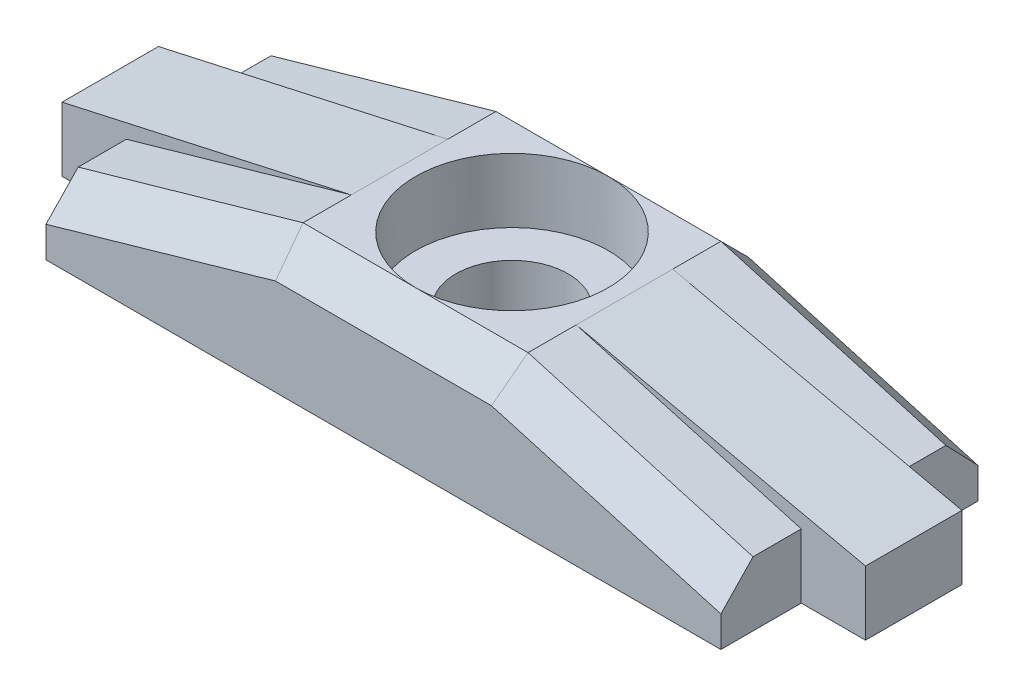
ISO-10303-21;
HEADER;
FILE_DESCRIPTION(('STEP AP214'),'2;1');
FILE_NAME('part.step','',(''),(''),'','','');
FILE_SCHEMA(('AUTOMOTIVE_DESIGN { 1 0 10303 214 1 1 1 1 }'));
ENDSEC;
DATA;
#1=APPLICATION_CONTEXT('core data for automotive mechanical design processes');
#2=APPLICATION_PROTOCOL_DEFINITION('international standard','automotive_design',2000,#1);
#3=PRODUCT_CONTEXT('',#1,'mechanical');
#4=PRODUCT('Part','Part','',(#3));
#5=PRODUCT_RELATED_PRODUCT_CATEGORY('part','',(#4));
#6=PRODUCT_DEFINITION_FORMATION('','',#4);
#7=PRODUCT_DEFINITION_CONTEXT('part definition',#1,'design');
#8=PRODUCT_DEFINITION('design','',#6,#7);
#9=PRODUCT_DEFINITION_SHAPE('','',#8);
#10=(LENGTH_UNIT() NAMED_UNIT(*) SI_UNIT(.MILLI.,.METRE.));
#11=(NAMED_UNIT(*) PLANE_ANGLE_UNIT() SI_UNIT($,.RADIAN.));
#12=(NAMED_UNIT(*) SI_UNIT($,.STERADIAN.) SOLID_ANGLE_UNIT());
#13=UNCERTAINTY_MEASURE_WITH_UNIT(LENGTH_MEASURE(1.E-05),#10,'distance_accuracy_value','');
#14=(GEOMETRIC_REPRESENTATION_CONTEXT(3) GLOBAL_UNCERTAINTY_ASSIGNED_CONTEXT((#13)) GLOBAL_UNIT_ASSIGNED_CONTEXT((#10,
#11,#12)) REPRESENTATION_CONTEXT('',''));
#15=CARTESIAN_POINT('',(0.,0.,0.));
#16=DIRECTION('',(0.,0.,1.));
#17=DIRECTION('',(1.,0.,0.));
#18=AXIS2_PLACEMENT_3D('',#15,#16,#17);
#19=CARTESIAN_POINT('',(-3.5,4.,26.5798724079689));
#20=DIRECTION('',(0.,-1.,0.));
#21=DIRECTION('',(0.,0.,-1.));
#22=AXIS2_PLACEMENT_3D('',#19,#20,#21);
#23=PLANE('',#22);
#24=DIRECTION('',(0.,0.,1.));
#25=VECTOR('',#24,1.);
#26=CARTESIAN_POINT('',(-3.5,4.,-25.095023109729));
#27=LINE('',#26,#25);
#28=CARTESIAN_POINT('',(-3.5,4.,1.5));
#29=VERTEX_POINT('',#28);
#30=CARTESIAN_POINT('',(-3.5,4.,3.));
#31=VERTEX_POINT('',#30);
#32=EDGE_CURVE('E408',#29,#31,#27,.T.);
#33=ORIENTED_EDGE('',*,*,#32,.T.);
#34=DIRECTION('',(1.,0.,0.));
#35=VECTOR('',#34,1.);
#36=CARTESIAN_POINT('',(-3.5,4.,3.));
#37=LINE('',#36,#35);
#38=CARTESIAN_POINT('',(0.,4.,3.));
#39=VERTEX_POINT('',#38);
#40=EDGE_CURVE('E318',#31,#39,#37,.T.);
#41=ORIENTED_EDGE('',*,*,#40,.T.);
#42=CARTESIAN_POINT('',(0.,4.,0.));
#43=DIRECTION('',(0.,1.,0.));
#44=DIRECTION('',(0.,0.,1.));
#45=AXIS2_PLACEMENT_3D('',#42,#43,#44);
#46=CIRCLE('',#45,3.);
#47=CARTESIAN_POINT('',(0.,4.,-3.));
#48=VERTEX_POINT('',#47);
#49=EDGE_CURVE('E339',#48,#39,#46,.T.);
#50=ORIENTED_EDGE('',*,*,#49,.F.);
#51=DIRECTION('',(-1.,0.,0.));
#52=VECTOR('',#51,1.);
#53=CARTESIAN_POINT('',(-3.5,4.,-3.));
#54=LINE('',#53,#52);
#55=CARTESIAN_POINT('',(-3.5,4.,-3.));
#56=VERTEX_POINT('',#55);
#57=EDGE_CURVE('E313',#48,#56,#54,.T.);
#58=ORIENTED_EDGE('',*,*,#57,.T.);
#59=CARTESIAN_POINT('',(-3.5,4.,-1.5));
#60=VERTEX_POINT('',#59);
#61=EDGE_CURVE('E193',#56,#60,#27,.T.);
#62=ORIENTED_EDGE('',*,*,#61,.T.);
#63=DIRECTION('',(0.,0.,-1.));
#64=VECTOR('',#63,1.);
#65=CARTESIAN_POINT('',(-3.5,4.,26.5798724079689));
#66=LINE('',#65,#64);
#67=EDGE_CURVE('E221',#29,#60,#66,.T.);
#68=ORIENTED_EDGE('',*,*,#67,.F.);
#69=EDGE_LOOP('',(#33,#41,#50,#58,#62,#68));
#70=FACE_BOUND('',#69,.T.);
#71=ADVANCED_FACE('F35',(#70),#23,.F.);
#72=CARTESIAN_POINT('',(0.,0.,0.));
#73=DIRECTION('',(0.,1.,0.));
#74=DIRECTION('',(0.,0.,1.));
#75=AXIS2_PLACEMENT_3D('',#72,#73,#74);
#76=CYLINDRICAL_SURFACE('',#75,1.75);
#77=CARTESIAN_POINT('',(0.,0.,0.));
#78=DIRECTION('',(0.,1.,0.));
#79=DIRECTION('',(0.,0.,1.));
#80=AXIS2_PLACEMENT_3D('',#77,#78,#79);
#81=CIRCLE('',#80,1.75);
#82=CARTESIAN_POINT('',(0.,0.,1.75));
#83=VERTEX_POINT('',#82);
#84=EDGE_CURVE('E206',#83,#83,#81,.T.);
#85=ORIENTED_EDGE('',*,*,#84,.F.);
#86=EDGE_LOOP('',(#85));
#87=FACE_BOUND('',#86,.T.);
#88=CARTESIAN_POINT('',(0.,2.,0.));
#89=DIRECTION('',(0.,1.,0.));
#90=DIRECTION('',(0.,0.,1.));
#91=AXIS2_PLACEMENT_3D('',#88,#89,#90);
#92=CIRCLE('',#91,1.75);
#93=CARTESIAN_POINT('',(0.,2.,1.75));
#94=VERTEX_POINT('',#93);
#95=EDGE_CURVE('E299',#94,#94,#92,.F.);
#96=ORIENTED_EDGE('',*,*,#95,.F.);
#97=EDGE_LOOP('',(#96));
#98=FACE_BOUND('',#97,.T.);
#99=ADVANCED_FACE('F437',(#87,#98),#76,.F.);
#100=CARTESIAN_POINT('',(0.,2.,-1.5));
#101=DIRECTION('',(0.,0.,-1.));
#102=DIRECTION('',(-1.,0.,0.));
#103=AXIS2_PLACEMENT_3D('',#100,#101,#102);
#104=PLANE('',#103);
#105=DIRECTION('',(0.961523947640823,-0.274721127897378,0.));
#106=VECTOR('',#105,1.);
#107=CARTESIAN_POINT('',(0.792452830188681,4.77358490566038,-1.5));
#108=LINE('',#107,#106);
#109=CARTESIAN_POINT('',(3.5,4.,-1.5));
#110=VERTEX_POINT('',#109);
#111=CARTESIAN_POINT('',(10.5,2.,-1.5));
#112=VERTEX_POINT('',#111);
#113=EDGE_CURVE('E192',#110,#112,#108,.T.);
#114=ORIENTED_EDGE('',*,*,#113,.F.);
#115=DIRECTION('',(-0.976187060183953,0.216930457818656,0.));
#116=VECTOR('',#115,1.);
#117=CARTESIAN_POINT('',(3.5,4.,-1.5));
#118=LINE('',#117,#116);
#119=CARTESIAN_POINT('',(12.5,2.,-1.5));
#120=VERTEX_POINT('',#119);
#121=EDGE_CURVE('E220',#120,#110,#118,.T.);
#122=ORIENTED_EDGE('',*,*,#121,.F.);
#123=DIRECTION('',(0.,-1.,0.));
#124=VECTOR('',#123,1.);
#125=CARTESIAN_POINT('',(12.5,2.,-1.5));
#126=LINE('',#125,#124);
#127=CARTESIAN_POINT('',(12.5,0.,-1.5));
#128=VERTEX_POINT('',#127);
#129=EDGE_CURVE('E291',#120,#128,#126,.T.);
#130=ORIENTED_EDGE('',*,*,#129,.T.);
#131=DIRECTION('',(1.,0.,0.));
#132=VECTOR('',#131,1.);
#133=CARTESIAN_POINT('',(0.,0.,-1.5));
#134=LINE('',#133,#132);
#135=CARTESIAN_POINT('',(10.5,0.,-1.5));
#136=VERTEX_POINT('',#135);
#137=EDGE_CURVE('E253',#136,#128,#134,.T.);
#138=ORIENTED_EDGE('',*,*,#137,.F.);
#139=DIRECTION('',(0.,-1.,0.));
#140=VECTOR('',#139,1.);
#141=CARTESIAN_POINT('',(10.5,2.,-1.5));
#142=LINE('',#141,#140);
#143=EDGE_CURVE('E289',#112,#136,#142,.T.);
#144=ORIENTED_EDGE('',*,*,#143,.F.);
#145=EDGE_LOOP('',(#114,#122,#130,#138,#144));
#146=FACE_BOUND('',#145,.T.);
#147=ADVANCED_FACE('F419',(#146),#104,.T.);
#148=CARTESIAN_POINT('',(0.,2.,1.5));
#149=DIRECTION('',(0.,0.,-1.));
#150=DIRECTION('',(-1.,0.,0.));
#151=AXIS2_PLACEMENT_3D('',#148,#149,#150);
#152=PLANE('',#151);
#153=DIRECTION('',(0.976187060183953,-0.216930457818656,0.));
#154=VECTOR('',#153,1.);
#155=CARTESIAN_POINT('',(3.5,4.,1.5));
#156=LINE('',#155,#154);
#157=CARTESIAN_POINT('',(3.5,4.,1.5));
#158=VERTEX_POINT('',#157);
#159=CARTESIAN_POINT('',(12.5,2.,1.5));
#160=VERTEX_POINT('',#159);
#161=EDGE_CURVE('E209',#158,#160,#156,.T.);
#162=ORIENTED_EDGE('',*,*,#161,.F.);
#163=DIRECTION('',(0.961523947640823,-0.274721127897378,0.));
#164=VECTOR('',#163,1.);
#165=CARTESIAN_POINT('',(0.792452830188681,4.77358490566038,1.5));
#166=LINE('',#165,#164);
#167=CARTESIAN_POINT('',(10.5,2.,1.5));
#168=VERTEX_POINT('',#167);
#169=EDGE_CURVE('E181',#158,#168,#166,.T.);
#170=ORIENTED_EDGE('',*,*,#169,.T.);
#171=DIRECTION('',(0.,-1.,0.));
#172=VECTOR('',#171,1.);
#173=CARTESIAN_POINT('',(10.5,2.,1.5));
#174=LINE('',#173,#172);
#175=CARTESIAN_POINT('',(10.5,0.,1.5));
#176=VERTEX_POINT('',#175);
#177=EDGE_CURVE('E294',#168,#176,#174,.T.);
#178=ORIENTED_EDGE('',*,*,#177,.T.);
#179=DIRECTION('',(1.,0.,0.));
#180=VECTOR('',#179,1.);
#181=CARTESIAN_POINT('',(0.,0.,1.5));
#182=LINE('',#181,#180);
#183=CARTESIAN_POINT('',(12.5,0.,1.5));
#184=VERTEX_POINT('',#183);
#185=EDGE_CURVE('E248',#176,#184,#182,.T.);
#186=ORIENTED_EDGE('',*,*,#185,.T.);
#187=DIRECTION('',(0.,-1.,0.));
#188=VECTOR('',#187,1.);
#189=CARTESIAN_POINT('',(12.5,2.,1.5));
#190=LINE('',#189,#188);
#191=EDGE_CURVE('E212',#160,#184,#190,.T.);
#192=ORIENTED_EDGE('',*,*,#191,.F.);
#193=EDGE_LOOP('',(#162,#170,#178,#186,#192));
#194=FACE_BOUND('',#193,.T.);
#195=ADVANCED_FACE('F210',(#194),#152,.F.);
#196=CARTESIAN_POINT('',(0.,2.,4.));
#197=DIRECTION('',(0.,0.,-1.));
#198=DIRECTION('',(-1.,0.,0.));
#199=AXIS2_PLACEMENT_3D('',#196,#197,#198);
#200=PLANE('',#199);
#201=DIRECTION('',(0.,-1.,0.));
#202=VECTOR('',#201,1.);
#203=CARTESIAN_POINT('',(10.5,2.,4.));
#204=LINE('',#203,#202);
#205=CARTESIAN_POINT('',(10.5,0.959984301531355,4.));
#206=VERTEX_POINT('',#205);
#207=CARTESIAN_POINT('',(10.5,0.,4.));
#208=VERTEX_POINT('',#207);
#209=EDGE_CURVE('E296',#206,#208,#204,.T.);
#210=ORIENTED_EDGE('',*,*,#209,.F.);
#211=DIRECTION('',(-0.961523947640823,0.274721127897378,0.));
#212=VECTOR('',#211,1.);
#213=CARTESIAN_POINT('',(3.22527887210262,3.03847605235918,4.));
#214=LINE('',#213,#212);
#215=CARTESIAN_POINT('',(3.35994505535974,3.,4.));
#216=VERTEX_POINT('',#215);
#217=EDGE_CURVE('E306',#206,#216,#214,.T.);
#218=ORIENTED_EDGE('',*,*,#217,.T.);
#219=DIRECTION('',(-1.,0.,0.));
#220=VECTOR('',#219,1.);
#221=CARTESIAN_POINT('',(0.,3.,4.));
#222=LINE('',#221,#220);
#223=CARTESIAN_POINT('',(-3.35994505535974,3.,4.));
#224=VERTEX_POINT('',#223);
#225=EDGE_CURVE('E304',#216,#224,#222,.T.);
#226=ORIENTED_EDGE('',*,*,#225,.T.);
#227=DIRECTION('',(-0.961523947640823,-0.274721127897378,0.));
#228=VECTOR('',#227,1.);
#229=CARTESIAN_POINT('',(-10.2252788721026,1.03847605235918,4.));
#230=LINE('',#229,#228);
#231=CARTESIAN_POINT('',(-10.5,0.959984301531356,4.));
#232=VERTEX_POINT('',#231);
#233=EDGE_CURVE('E298',#224,#232,#230,.T.);
#234=ORIENTED_EDGE('',*,*,#233,.T.);
#235=DIRECTION('',(0.,-1.,0.));
#236=VECTOR('',#235,1.);
#237=CARTESIAN_POINT('',(-10.5,2.,4.));
#238=LINE('',#237,#236);
#239=CARTESIAN_POINT('',(-10.5,0.,4.));
#240=VERTEX_POINT('',#239);
#241=EDGE_CURVE('E243',#232,#240,#238,.T.);
#242=ORIENTED_EDGE('',*,*,#241,.T.);
#243=DIRECTION('',(1.,0.,0.));
#244=VECTOR('',#243,1.);
#245=CARTESIAN_POINT('',(0.,0.,4.));
#246=LINE('',#245,#244);
#247=EDGE_CURVE('E216',#240,#208,#246,.T.);
#248=ORIENTED_EDGE('',*,*,#247,.T.);
#249=EDGE_LOOP('',(#210,#218,#226,#234,#242,#248));
#250=FACE_BOUND('',#249,.T.);
#251=ADVANCED_FACE('F433',(#250),#200,.F.);
#252=CARTESIAN_POINT('',(10.5,2.,0.));
#253=DIRECTION('',(-1.,0.,0.));
#254=DIRECTION('',(0.,0.,1.));
#255=AXIS2_PLACEMENT_3D('',#252,#253,#254);
#256=PLANE('',#255);
#257=DIRECTION('',(0.,0.,-1.));
#258=VECTOR('',#257,1.);
#259=CARTESIAN_POINT('',(10.5,2.,0.));
#260=LINE('',#259,#258);
#261=CARTESIAN_POINT('',(10.5,2.,2.99999999999999));
#262=VERTEX_POINT('',#261);
#263=EDGE_CURVE('E187',#262,#168,#260,.T.);
#264=ORIENTED_EDGE('',*,*,#263,.F.);
#265=DIRECTION('',(0.,-0.720838291947128,0.693103280083674));
#266=VECTOR('',#265,1.);
#267=CARTESIAN_POINT('',(10.5,2.4419457014713,2.57505862447842));
#268=LINE('',#267,#266);
#269=EDGE_CURVE('E311',#262,#206,#268,.T.);
#270=ORIENTED_EDGE('',*,*,#269,.T.);
#271=ORIENTED_EDGE('',*,*,#209,.T.);
#272=DIRECTION('',(0.,0.,-1.));
#273=VECTOR('',#272,1.);
#274=CARTESIAN_POINT('',(10.5,0.,0.));
#275=LINE('',#274,#273);
#276=EDGE_CURVE('E246',#208,#176,#275,.T.);
#277=ORIENTED_EDGE('',*,*,#276,.T.);
#278=ORIENTED_EDGE('',*,*,#177,.F.);
#279=EDGE_LOOP('',(#264,#270,#271,#277,#278));
#280=FACE_BOUND('',#279,.T.);
#281=ADVANCED_FACE('F426',(#280),#256,.F.);
#282=CARTESIAN_POINT('',(12.5,2.,0.));
#283=DIRECTION('',(-1.,0.,0.));
#284=DIRECTION('',(0.,0.,1.));
#285=AXIS2_PLACEMENT_3D('',#282,#283,#284);
#286=PLANE('',#285);
#287=DIRECTION('',(0.,0.,-1.));
#288=VECTOR('',#287,1.);
#289=CARTESIAN_POINT('',(12.5,0.,0.));
#290=LINE('',#289,#288);
#291=EDGE_CURVE('E250',#184,#128,#290,.T.);
#292=ORIENTED_EDGE('',*,*,#291,.T.);
#293=ORIENTED_EDGE('',*,*,#129,.F.);
#294=DIRECTION('',(0.,0.,-1.));
#295=VECTOR('',#294,1.);
#296=CARTESIAN_POINT('',(12.5,2.,0.));
#297=LINE('',#296,#295);
#298=EDGE_CURVE('E230',#160,#120,#297,.T.);
#299=ORIENTED_EDGE('',*,*,#298,.F.);
#300=ORIENTED_EDGE('',*,*,#191,.T.);
#301=EDGE_LOOP('',(#292,#293,#299,#300));
#302=FACE_BOUND('',#301,.T.);
#303=ADVANCED_FACE('F424',(#302),#286,.F.);
#304=CARTESIAN_POINT('',(10.5,2.,0.));
#305=DIRECTION('',(-1.,0.,0.));
#306=DIRECTION('',(0.,0.,1.));
#307=AXIS2_PLACEMENT_3D('',#304,#305,#306);
#308=PLANE('',#307);
#309=DIRECTION('',(0.,-1.,0.));
#310=VECTOR('',#309,1.);
#311=CARTESIAN_POINT('',(10.5,2.,-4.));
#312=LINE('',#311,#310);
#313=CARTESIAN_POINT('',(10.5,0.959984301531352,-4.));
#314=VERTEX_POINT('',#313);
#315=CARTESIAN_POINT('',(10.5,0.,-4.));
#316=VERTEX_POINT('',#315);
#317=EDGE_CURVE('E287',#314,#316,#312,.T.);
#318=ORIENTED_EDGE('',*,*,#317,.F.);
#319=DIRECTION('',(0.,-0.72083829194713,-0.693103280083672));
#320=VECTOR('',#319,1.);
#321=CARTESIAN_POINT('',(10.5,2.,-3.));
#322=LINE('',#321,#320);
#323=CARTESIAN_POINT('',(10.5,2.,-3.));
#324=VERTEX_POINT('',#323);
#325=EDGE_CURVE('E12',#314,#324,#322,.F.);
#326=ORIENTED_EDGE('',*,*,#325,.T.);
#327=DIRECTION('',(0.,0.,-1.));
#328=VECTOR('',#327,1.);
#329=CARTESIAN_POINT('',(10.5,2.,0.));
#330=LINE('',#329,#328);
#331=EDGE_CURVE('E233',#112,#324,#330,.T.);
#332=ORIENTED_EDGE('',*,*,#331,.F.);
#333=ORIENTED_EDGE('',*,*,#143,.T.);
#334=DIRECTION('',(0.,0.,-1.));
#335=VECTOR('',#334,1.);
#336=CARTESIAN_POINT('',(10.5,0.,0.));
#337=LINE('',#336,#335);
#338=EDGE_CURVE('E256',#136,#316,#337,.T.);
#339=ORIENTED_EDGE('',*,*,#338,.T.);
#340=EDGE_LOOP('',(#318,#326,#332,#333,#339));
#341=FACE_BOUND('',#340,.T.);
#342=ADVANCED_FACE('F356',(#341),#308,.F.);
#343=CARTESIAN_POINT('',(0.,2.,-4.));
#344=DIRECTION('',(0.,0.,-1.));
#345=DIRECTION('',(-1.,0.,0.));
#346=AXIS2_PLACEMENT_3D('',#343,#344,#345);
#347=PLANE('',#346);
#348=DIRECTION('',(0.,-1.,0.));
#349=VECTOR('',#348,1.);
#350=CARTESIAN_POINT('',(-10.5,2.,-4.));
#351=LINE('',#350,#349);
#352=CARTESIAN_POINT('',(-10.5,0.959984301531351,-4.));
#353=VERTEX_POINT('',#352);
#354=CARTESIAN_POINT('',(-10.5,0.,-4.));
#355=VERTEX_POINT('',#354);
#356=EDGE_CURVE('E285',#353,#355,#351,.T.);
#357=ORIENTED_EDGE('',*,*,#356,.F.);
#358=DIRECTION('',(0.961523947640823,0.274721127897378,0.));
#359=VECTOR('',#358,1.);
#360=CARTESIAN_POINT('',(-0.517731702291301,3.81206095801955,-4.));
#361=LINE('',#360,#359);
#362=CARTESIAN_POINT('',(-3.35994505535974,3.,-4.));
#363=VERTEX_POINT('',#362);
#364=EDGE_CURVE('E58',#353,#363,#361,.T.);
#365=ORIENTED_EDGE('',*,*,#364,.T.);
#366=DIRECTION('',(1.,0.,0.));
#367=VECTOR('',#366,1.);
#368=CARTESIAN_POINT('',(3.5,3.,-4.));
#369=LINE('',#368,#367);
#370=CARTESIAN_POINT('',(3.35994505535974,3.,-4.));
#371=VERTEX_POINT('',#370);
#372=EDGE_CURVE('E331',#363,#371,#369,.T.);
#373=ORIENTED_EDGE('',*,*,#372,.T.);
#374=DIRECTION('',(0.961523947640823,-0.274721127897378,0.));
#375=VECTOR('',#374,1.);
#376=CARTESIAN_POINT('',(0.517731702291302,3.81206095801955,-4.));
#377=LINE('',#376,#375);
#378=EDGE_CURVE('E329',#371,#314,#377,.T.);
#379=ORIENTED_EDGE('',*,*,#378,.T.);
#380=ORIENTED_EDGE('',*,*,#317,.T.);
#381=DIRECTION('',(1.,0.,0.));
#382=VECTOR('',#381,1.);
#383=CARTESIAN_POINT('',(0.,0.,-4.));
#384=LINE('',#383,#382);
#385=EDGE_CURVE('E259',#355,#316,#384,.T.);
#386=ORIENTED_EDGE('',*,*,#385,.F.);
#387=EDGE_LOOP('',(#357,#365,#373,#379,#380,#386));
#388=FACE_BOUND('',#387,.T.);
#389=ADVANCED_FACE('F354',(#388),#347,.T.);
#390=CARTESIAN_POINT('',(-10.5,2.,0.));
#391=DIRECTION('',(-1.,0.,0.));
#392=DIRECTION('',(0.,0.,1.));
#393=AXIS2_PLACEMENT_3D('',#390,#391,#392);
#394=PLANE('',#393);
#395=DIRECTION('',(0.,0.,-1.));
#396=VECTOR('',#395,1.);
#397=CARTESIAN_POINT('',(-10.5,2.,0.));
#398=LINE('',#397,#396);
#399=CARTESIAN_POINT('',(-10.5,2.,-1.5));
#400=VERTEX_POINT('',#399);
#401=CARTESIAN_POINT('',(-10.5,2.,-3.));
#402=VERTEX_POINT('',#401);
#403=EDGE_CURVE('E235',#400,#402,#398,.T.);
#404=ORIENTED_EDGE('',*,*,#403,.T.);
#405=DIRECTION('',(0.,0.72083829194713,0.693103280083672));
#406=VECTOR('',#405,1.);
#407=CARTESIAN_POINT('',(-10.5,3.4988461536754,-1.55882352941177));
#408=LINE('',#407,#406);
#409=EDGE_CURVE('E327',#402,#353,#408,.F.);
#410=ORIENTED_EDGE('',*,*,#409,.T.);
#411=ORIENTED_EDGE('',*,*,#356,.T.);
#412=DIRECTION('',(0.,0.,-1.));
#413=VECTOR('',#412,1.);
#414=CARTESIAN_POINT('',(-10.5,0.,0.));
#415=LINE('',#414,#413);
#416=CARTESIAN_POINT('',(-10.5,0.,-1.5));
#417=VERTEX_POINT('',#416);
#418=EDGE_CURVE('E262',#417,#355,#415,.T.);
#419=ORIENTED_EDGE('',*,*,#418,.F.);
#420=DIRECTION('',(0.,-1.,0.));
#421=VECTOR('',#420,1.);
#422=CARTESIAN_POINT('',(-10.5,2.,-1.5));
#423=LINE('',#422,#421);
#424=EDGE_CURVE('E283',#400,#417,#423,.T.);
#425=ORIENTED_EDGE('',*,*,#424,.F.);
#426=EDGE_LOOP('',(#404,#410,#411,#419,#425));
#427=FACE_BOUND('',#426,.T.);
#428=ADVANCED_FACE('F371',(#427),#394,.T.);
#429=DIRECTION('',(0.961523947640823,0.274721127897378,0.));
#430=VECTOR('',#429,1.);
#431=CARTESIAN_POINT('',(-0.79245283018868,4.77358490566038,-1.5));
#432=LINE('',#431,#430);
#433=EDGE_CURVE('E377',#400,#60,#432,.T.);
#434=ORIENTED_EDGE('',*,*,#433,.F.);
#435=ORIENTED_EDGE('',*,*,#424,.T.);
#436=DIRECTION('',(1.,0.,0.));
#437=VECTOR('',#436,1.);
#438=CARTESIAN_POINT('',(0.,0.,-1.5));
#439=LINE('',#438,#437);
#440=CARTESIAN_POINT('',(-12.5,0.,-1.5));
#441=VERTEX_POINT('',#440);
#442=EDGE_CURVE('E265',#441,#417,#439,.T.);
#443=ORIENTED_EDGE('',*,*,#442,.F.);
#444=DIRECTION('',(0.,-1.,0.));
#445=VECTOR('',#444,1.);
#446=CARTESIAN_POINT('',(-12.5,2.,-1.5));
#447=LINE('',#446,#445);
#448=CARTESIAN_POINT('',(-12.5,2.,-1.5));
#449=VERTEX_POINT('',#448);
#450=EDGE_CURVE('E281',#449,#441,#447,.T.);
#451=ORIENTED_EDGE('',*,*,#450,.F.);
#452=DIRECTION('',(-0.976187060183953,-0.216930457818656,0.));
#453=VECTOR('',#452,1.);
#454=CARTESIAN_POINT('',(-12.5,2.,-1.5));
#455=LINE('',#454,#453);
#456=EDGE_CURVE('E226',#60,#449,#455,.T.);
#457=ORIENTED_EDGE('',*,*,#456,.F.);
#458=EDGE_LOOP('',(#434,#435,#443,#451,#457));
#459=FACE_BOUND('',#458,.T.);
#460=ADVANCED_FACE('F374',(#459),#104,.T.);
#461=CARTESIAN_POINT('',(-12.5,2.,0.));
#462=DIRECTION('',(-1.,0.,0.));
#463=DIRECTION('',(0.,0.,1.));
#464=AXIS2_PLACEMENT_3D('',#461,#462,#463);
#465=PLANE('',#464);
#466=DIRECTION('',(0.,0.,-1.));
#467=VECTOR('',#466,1.);
#468=CARTESIAN_POINT('',(-12.5,0.,0.));
#469=LINE('',#468,#467);
#470=CARTESIAN_POINT('',(-12.5,0.,1.5));
#471=VERTEX_POINT('',#470);
#472=EDGE_CURVE('E268',#471,#441,#469,.T.);
#473=ORIENTED_EDGE('',*,*,#472,.F.);
#474=DIRECTION('',(0.,-1.,0.));
#475=VECTOR('',#474,1.);
#476=CARTESIAN_POINT('',(-12.5,2.,1.5));
#477=LINE('',#476,#475);
#478=CARTESIAN_POINT('',(-12.5,2.,1.5));
#479=VERTEX_POINT('',#478);
#480=EDGE_CURVE('E279',#479,#471,#477,.T.);
#481=ORIENTED_EDGE('',*,*,#480,.F.);
#482=DIRECTION('',(0.,0.,-1.));
#483=VECTOR('',#482,1.);
#484=CARTESIAN_POINT('',(-12.5,2.,0.));
#485=LINE('',#484,#483);
#486=EDGE_CURVE('E238',#479,#449,#485,.T.);
#487=ORIENTED_EDGE('',*,*,#486,.T.);
#488=ORIENTED_EDGE('',*,*,#450,.T.);
#489=EDGE_LOOP('',(#473,#481,#487,#488));
#490=FACE_BOUND('',#489,.T.);
#491=ADVANCED_FACE('F392',(#490),#465,.T.);
#492=DIRECTION('',(0.,-1.,0.));
#493=VECTOR('',#492,1.);
#494=CARTESIAN_POINT('',(-10.5,2.,1.5));
#495=LINE('',#494,#493);
#496=CARTESIAN_POINT('',(-10.5,2.,1.5));
#497=VERTEX_POINT('',#496);
#498=CARTESIAN_POINT('',(-10.5,0.,1.5));
#499=VERTEX_POINT('',#498);
#500=EDGE_CURVE('E277',#497,#499,#495,.T.);
#501=ORIENTED_EDGE('',*,*,#500,.F.);
#502=DIRECTION('',(0.961523947640823,0.274721127897378,0.));
#503=VECTOR('',#502,1.);
#504=CARTESIAN_POINT('',(-0.79245283018868,4.77358490566038,1.5));
#505=LINE('',#504,#503);
#506=EDGE_CURVE('E378',#497,#29,#505,.T.);
#507=ORIENTED_EDGE('',*,*,#506,.T.);
#508=DIRECTION('',(0.976187060183953,0.216930457818656,0.));
#509=VECTOR('',#508,1.);
#510=CARTESIAN_POINT('',(-12.5,2.,1.5));
#511=LINE('',#510,#509);
#512=EDGE_CURVE('E217',#479,#29,#511,.T.);
#513=ORIENTED_EDGE('',*,*,#512,.F.);
#514=ORIENTED_EDGE('',*,*,#480,.T.);
#515=DIRECTION('',(1.,0.,0.));
#516=VECTOR('',#515,1.);
#517=CARTESIAN_POINT('',(0.,0.,1.5));
#518=LINE('',#517,#516);
#519=EDGE_CURVE('E271',#471,#499,#518,.T.);
#520=ORIENTED_EDGE('',*,*,#519,.T.);
#521=EDGE_LOOP('',(#501,#507,#513,#514,#520));
#522=FACE_BOUND('',#521,.T.);
#523=ADVANCED_FACE('F396',(#522),#152,.F.);
#524=CARTESIAN_POINT('',(-10.5,2.,0.));
#525=DIRECTION('',(-1.,0.,0.));
#526=DIRECTION('',(0.,0.,1.));
#527=AXIS2_PLACEMENT_3D('',#524,#525,#526);
#528=PLANE('',#527);
#529=ORIENTED_EDGE('',*,*,#241,.F.);
#530=DIRECTION('',(0.,0.720838291947128,-0.693103280083674));
#531=VECTOR('',#530,1.);
#532=CARTESIAN_POINT('',(-10.5,3.4988461536754,1.55882352941176));
#533=LINE('',#532,#531);
#534=CARTESIAN_POINT('',(-10.5,2.,3.));
#535=VERTEX_POINT('',#534);
#536=EDGE_CURVE('E320',#232,#535,#533,.T.);
#537=ORIENTED_EDGE('',*,*,#536,.T.);
#538=DIRECTION('',(0.,0.,-1.));
#539=VECTOR('',#538,1.);
#540=CARTESIAN_POINT('',(-10.5,2.,0.));
#541=LINE('',#540,#539);
#542=EDGE_CURVE('E241',#535,#497,#541,.T.);
#543=ORIENTED_EDGE('',*,*,#542,.T.);
#544=ORIENTED_EDGE('',*,*,#500,.T.);
#545=DIRECTION('',(0.,0.,-1.));
#546=VECTOR('',#545,1.);
#547=CARTESIAN_POINT('',(-10.5,0.,0.));
#548=LINE('',#547,#546);
#549=EDGE_CURVE('E231',#240,#499,#548,.T.);
#550=ORIENTED_EDGE('',*,*,#549,.F.);
#551=EDGE_LOOP('',(#529,#537,#543,#544,#550));
#552=FACE_BOUND('',#551,.T.);
#553=ADVANCED_FACE('F401',(#552),#528,.T.);
#554=CARTESIAN_POINT('',(0.,0.,0.));
#555=DIRECTION('',(0.,1.,0.));
#556=DIRECTION('',(0.,0.,1.));
#557=AXIS2_PLACEMENT_3D('',#554,#555,#556);
#558=PLANE('',#557);
#559=ORIENTED_EDGE('',*,*,#84,.T.);
#560=EDGE_LOOP('',(#559));
#561=FACE_BOUND('',#560,.T.);
#562=ORIENTED_EDGE('',*,*,#247,.F.);
#563=ORIENTED_EDGE('',*,*,#549,.T.);
#564=ORIENTED_EDGE('',*,*,#519,.F.);
#565=ORIENTED_EDGE('',*,*,#472,.T.);
#566=ORIENTED_EDGE('',*,*,#442,.T.);
#567=ORIENTED_EDGE('',*,*,#418,.T.);
#568=ORIENTED_EDGE('',*,*,#385,.T.);
#569=ORIENTED_EDGE('',*,*,#338,.F.);
#570=ORIENTED_EDGE('',*,*,#137,.T.);
#571=ORIENTED_EDGE('',*,*,#291,.F.);
#572=ORIENTED_EDGE('',*,*,#185,.F.);
#573=ORIENTED_EDGE('',*,*,#276,.F.);
#574=EDGE_LOOP('',(#562,#563,#564,#565,#566,#567,#568,#569,#570,#571,#572,#573));
#575=FACE_BOUND('',#574,.T.);
#576=ADVANCED_FACE('F361',(#561,#575),#558,.F.);
#577=CARTESIAN_POINT('',(-12.5,2.,26.5798724079689));
#578=DIRECTION('',(0.216930457818656,-0.976187060183953,0.));
#579=DIRECTION('',(0.976187060183953,0.216930457818656,0.));
#580=AXIS2_PLACEMENT_3D('',#577,#578,#579);
#581=PLANE('',#580);
#582=ORIENTED_EDGE('',*,*,#486,.F.);
#583=ORIENTED_EDGE('',*,*,#512,.T.);
#584=ORIENTED_EDGE('',*,*,#67,.T.);
#585=ORIENTED_EDGE('',*,*,#456,.T.);
#586=EDGE_LOOP('',(#582,#583,#584,#585));
#587=FACE_BOUND('',#586,.T.);
#588=ADVANCED_FACE('F387',(#587),#581,.F.);
#589=EDGE_CURVE('E477',#39,#48,#46,.T.);
#590=ORIENTED_EDGE('',*,*,#589,.F.);
#591=DIRECTION('',(1.,0.,0.));
#592=VECTOR('',#591,1.);
#593=CARTESIAN_POINT('',(-3.5,4.,3.));
#594=LINE('',#593,#592);
#595=CARTESIAN_POINT('',(3.5,4.,3.));
#596=VERTEX_POINT('',#595);
#597=EDGE_CURVE('E204',#39,#596,#594,.T.);
#598=ORIENTED_EDGE('',*,*,#597,.T.);
#599=DIRECTION('',(0.,0.,1.));
#600=VECTOR('',#599,1.);
#601=CARTESIAN_POINT('',(3.5,4.,-25.095023109729));
#602=LINE('',#601,#600);
#603=EDGE_CURVE('E184',#158,#596,#602,.T.);
#604=ORIENTED_EDGE('',*,*,#603,.F.);
#605=DIRECTION('',(0.,0.,-1.));
#606=VECTOR('',#605,1.);
#607=CARTESIAN_POINT('',(3.5,4.,26.5798724079689));
#608=LINE('',#607,#606);
#609=EDGE_CURVE('E201',#158,#110,#608,.T.);
#610=ORIENTED_EDGE('',*,*,#609,.T.);
#611=CARTESIAN_POINT('',(3.5,4.,-3.));
#612=VERTEX_POINT('',#611);
#613=EDGE_CURVE('E205',#612,#110,#602,.T.);
#614=ORIENTED_EDGE('',*,*,#613,.F.);
#615=DIRECTION('',(-1.,0.,0.));
#616=VECTOR('',#615,1.);
#617=CARTESIAN_POINT('',(-3.5,4.,-3.));
#618=LINE('',#617,#616);
#619=EDGE_CURVE('E315',#612,#48,#618,.T.);
#620=ORIENTED_EDGE('',*,*,#619,.T.);
#621=EDGE_LOOP('',(#590,#598,#604,#610,#614,#620));
#622=FACE_BOUND('',#621,.T.);
#623=ADVANCED_FACE('F198',(#622),#23,.F.);
#624=CARTESIAN_POINT('',(3.5,4.,26.5798724079689));
#625=DIRECTION('',(-0.216930457818656,-0.976187060183953,0.));
#626=DIRECTION('',(0.976187060183953,-0.216930457818656,0.));
#627=AXIS2_PLACEMENT_3D('',#624,#625,#626);
#628=PLANE('',#627);
#629=ORIENTED_EDGE('',*,*,#609,.F.);
#630=ORIENTED_EDGE('',*,*,#161,.T.);
#631=ORIENTED_EDGE('',*,*,#298,.T.);
#632=ORIENTED_EDGE('',*,*,#121,.T.);
#633=EDGE_LOOP('',(#629,#630,#631,#632));
#634=FACE_BOUND('',#633,.T.);
#635=ADVANCED_FACE('F219',(#634),#628,.F.);
#636=CARTESIAN_POINT('',(-3.5,4.,-25.095023109729));
#637=DIRECTION('',(-0.274721127897378,0.961523947640823,0.));
#638=DIRECTION('',(-0.961523947640823,-0.274721127897378,0.));
#639=AXIS2_PLACEMENT_3D('',#636,#637,#638);
#640=PLANE('',#639);
#641=ORIENTED_EDGE('',*,*,#542,.F.);
#642=DIRECTION('',(0.961523947640823,0.274721127897378,0.));
#643=VECTOR('',#642,1.);
#644=CARTESIAN_POINT('',(-3.5,4.,3.));
#645=LINE('',#644,#643);
#646=EDGE_CURVE('E322',#535,#31,#645,.T.);
#647=ORIENTED_EDGE('',*,*,#646,.T.);
#648=ORIENTED_EDGE('',*,*,#32,.F.);
#649=ORIENTED_EDGE('',*,*,#506,.F.);
#650=EDGE_LOOP('',(#641,#647,#648,#649));
#651=FACE_BOUND('',#650,.T.);
#652=ADVANCED_FACE('F451',(#651),#640,.T.);
#653=CARTESIAN_POINT('',(10.5,2.,-25.095023109729));
#654=DIRECTION('',(0.274721127897378,0.961523947640823,0.));
#655=DIRECTION('',(-0.961523947640823,0.274721127897378,0.));
#656=AXIS2_PLACEMENT_3D('',#653,#654,#655);
#657=PLANE('',#656);
#658=ORIENTED_EDGE('',*,*,#603,.T.);
#659=DIRECTION('',(0.961523947640823,-0.274721127897378,0.));
#660=VECTOR('',#659,1.);
#661=CARTESIAN_POINT('',(10.5,2.,2.99999999999999));
#662=LINE('',#661,#660);
#663=EDGE_CURVE('E309',#596,#262,#662,.T.);
#664=ORIENTED_EDGE('',*,*,#663,.T.);
#665=ORIENTED_EDGE('',*,*,#263,.T.);
#666=ORIENTED_EDGE('',*,*,#169,.F.);
#667=EDGE_LOOP('',(#658,#664,#665,#666));
#668=FACE_BOUND('',#667,.T.);
#669=ADVANCED_FACE('F183',(#668),#657,.T.);
#670=ORIENTED_EDGE('',*,*,#331,.T.);
#671=DIRECTION('',(-0.961523947640823,0.274721127897378,0.));
#672=VECTOR('',#671,1.);
#673=CARTESIAN_POINT('',(10.5,2.,-3.));
#674=LINE('',#673,#672);
#675=EDGE_CURVE('E44',#324,#612,#674,.T.);
#676=ORIENTED_EDGE('',*,*,#675,.T.);
#677=ORIENTED_EDGE('',*,*,#613,.T.);
#678=ORIENTED_EDGE('',*,*,#113,.T.);
#679=EDGE_LOOP('',(#670,#676,#677,#678));
#680=FACE_BOUND('',#679,.T.);
#681=ADVANCED_FACE('F417',(#680),#657,.T.);
#682=ORIENTED_EDGE('',*,*,#61,.F.);
#683=DIRECTION('',(-0.961523947640823,-0.274721127897378,0.));
#684=VECTOR('',#683,1.);
#685=CARTESIAN_POINT('',(-3.5,4.,-3.));
#686=LINE('',#685,#684);
#687=EDGE_CURVE('E324',#56,#402,#686,.T.);
#688=ORIENTED_EDGE('',*,*,#687,.T.);
#689=ORIENTED_EDGE('',*,*,#403,.F.);
#690=ORIENTED_EDGE('',*,*,#433,.T.);
#691=EDGE_LOOP('',(#682,#688,#689,#690));
#692=FACE_BOUND('',#691,.T.);
#693=ADVANCED_FACE('F368',(#692),#640,.T.);
#694=CARTESIAN_POINT('',(0.,2.,0.));
#695=DIRECTION('',(0.,1.,0.));
#696=DIRECTION('',(0.,0.,1.));
#697=AXIS2_PLACEMENT_3D('',#694,#695,#696);
#698=PLANE('',#697);
#699=CARTESIAN_POINT('',(0.,2.,0.));
#700=DIRECTION('',(0.,1.,0.));
#701=DIRECTION('',(0.,0.,1.));
#702=AXIS2_PLACEMENT_3D('',#699,#700,#701);
#703=CIRCLE('',#702,3.);
#704=CARTESIAN_POINT('',(0.,2.,3.));
#705=VERTEX_POINT('',#704);
#706=EDGE_CURVE('E302',#705,#705,#703,.F.);
#707=ORIENTED_EDGE('',*,*,#706,.F.);
#708=EDGE_LOOP('',(#707));
#709=FACE_BOUND('',#708,.T.);
#710=ORIENTED_EDGE('',*,*,#95,.T.);
#711=EDGE_LOOP('',(#710));
#712=FACE_BOUND('',#711,.T.);
#713=ADVANCED_FACE('F461',(#709,#712),#698,.T.);
#714=CARTESIAN_POINT('',(0.,-8.48528137423857,0.));
#715=DIRECTION('',(0.,1.,0.));
#716=DIRECTION('',(0.,0.,1.));
#717=AXIS2_PLACEMENT_3D('',#714,#715,#716);
#718=CYLINDRICAL_SURFACE('',#717,3.);
#719=ORIENTED_EDGE('',*,*,#706,.T.);
#720=EDGE_LOOP('',(#719));
#721=FACE_BOUND('',#720,.T.);
#722=ORIENTED_EDGE('',*,*,#589,.T.);
#723=ORIENTED_EDGE('',*,*,#49,.T.);
#724=EDGE_LOOP('',(#722,#723));
#725=FACE_BOUND('',#724,.T.);
#726=ADVANCED_FACE('F463',(#721,#725),#718,.F.);
#727=CARTESIAN_POINT('',(-0.517731702291302,3.81206095801956,4.));
#728=DIRECTION('',(-0.194257172471453,0.679900103650086,0.707106781186546));
#729=DIRECTION('',(0.961523947640823,0.274721127897378,0.));
#730=AXIS2_PLACEMENT_3D('',#727,#728,#729);
#731=PLANE('',#730);
#732=ORIENTED_EDGE('',*,*,#536,.F.);
#733=ORIENTED_EDGE('',*,*,#233,.F.);
#734=DIRECTION('',(0.09855169785383,-0.703664537563931,0.703664537563935));
#735=VECTOR('',#734,1.);
#736=CARTESIAN_POINT('',(-3.38865450001365,3.20498701225905,3.79501298774095));
#737=LINE('',#736,#735);
#738=EDGE_CURVE('E337',#31,#224,#737,.T.);
#739=ORIENTED_EDGE('',*,*,#738,.F.);
#740=ORIENTED_EDGE('',*,*,#646,.F.);
#741=EDGE_LOOP('',(#732,#733,#739,#740));
#742=FACE_BOUND('',#741,.T.);
#743=ADVANCED_FACE('F466',(#742),#731,.T.);
#744=CARTESIAN_POINT('',(0.,3.,4.));
#745=DIRECTION('',(0.,-0.707106781186549,-0.707106781186546));
#746=DIRECTION('',(-1.,0.,0.));
#747=AXIS2_PLACEMENT_3D('',#744,#745,#746);
#748=PLANE('',#747);
#749=ORIENTED_EDGE('',*,*,#738,.T.);
#750=ORIENTED_EDGE('',*,*,#225,.F.);
#751=DIRECTION('',(-0.0985516978538301,-0.703664537563932,0.703664537563935));
#752=VECTOR('',#751,1.);
#753=CARTESIAN_POINT('',(3.32731180018253,2.76699676501228,4.23300323498772));
#754=LINE('',#753,#752);
#755=EDGE_CURVE('E335',#596,#216,#754,.T.);
#756=ORIENTED_EDGE('',*,*,#755,.F.);
#757=ORIENTED_EDGE('',*,*,#597,.F.);
#758=ORIENTED_EDGE('',*,*,#40,.F.);
#759=EDGE_LOOP('',(#749,#750,#756,#757,#758));
#760=FACE_BOUND('',#759,.T.);
#761=ADVANCED_FACE('F485',(#760),#748,.F.);
#762=CARTESIAN_POINT('',(0.517731702291303,3.81206095801956,4.));
#763=DIRECTION('',(0.194257172471454,0.679900103650086,0.707106781186546));
#764=DIRECTION('',(0.961523947640823,-0.274721127897378,0.));
#765=AXIS2_PLACEMENT_3D('',#762,#763,#764);
#766=PLANE('',#765);
#767=ORIENTED_EDGE('',*,*,#269,.F.);
#768=ORIENTED_EDGE('',*,*,#663,.F.);
#769=ORIENTED_EDGE('',*,*,#755,.T.);
#770=ORIENTED_EDGE('',*,*,#217,.F.);
#771=EDGE_LOOP('',(#767,#768,#769,#770));
#772=FACE_BOUND('',#771,.T.);
#773=ADVANCED_FACE('F490',(#772),#766,.T.);
#774=CARTESIAN_POINT('',(10.5,2.,-3.));
#775=DIRECTION('',(-0.194257172471453,-0.679900103650085,0.707106781186548));
#776=DIRECTION('',(-0.961523947640823,0.274721127897378,0.));
#777=AXIS2_PLACEMENT_3D('',#774,#775,#776);
#778=PLANE('',#777);
#779=ORIENTED_EDGE('',*,*,#325,.F.);
#780=ORIENTED_EDGE('',*,*,#378,.F.);
#781=DIRECTION('',(-0.0985516978538306,-0.703664537563933,-0.703664537563933));
#782=VECTOR('',#781,1.);
#783=CARTESIAN_POINT('',(3.4292923902562,3.49514378142507,-3.50485621857493));
#784=LINE('',#783,#782);
#785=EDGE_CURVE('E39',#612,#371,#784,.T.);
#786=ORIENTED_EDGE('',*,*,#785,.F.);
#787=ORIENTED_EDGE('',*,*,#675,.F.);
#788=EDGE_LOOP('',(#779,#780,#786,#787));
#789=FACE_BOUND('',#788,.T.);
#790=ADVANCED_FACE('F37',(#789),#778,.F.);
#791=CARTESIAN_POINT('',(-3.5,4.,-3.));
#792=DIRECTION('',(0.,0.707106781186547,-0.707106781186548));
#793=DIRECTION('',(1.,0.,0.));
#794=AXIS2_PLACEMENT_3D('',#791,#792,#793);
#795=PLANE('',#794);
#796=ORIENTED_EDGE('',*,*,#785,.T.);
#797=ORIENTED_EDGE('',*,*,#372,.F.);
#798=DIRECTION('',(0.0985516978538307,-0.703664537563933,-0.703664537563933));
#799=VECTOR('',#798,1.);
#800=CARTESIAN_POINT('',(-3.5,4.,-3.));
#801=LINE('',#800,#799);
#802=EDGE_CURVE('E340',#56,#363,#801,.T.);
#803=ORIENTED_EDGE('',*,*,#802,.F.);
#804=ORIENTED_EDGE('',*,*,#57,.F.);
#805=ORIENTED_EDGE('',*,*,#619,.F.);
#806=EDGE_LOOP('',(#796,#797,#803,#804,#805));
#807=FACE_BOUND('',#806,.T.);
#808=ADVANCED_FACE('F349',(#807),#795,.T.);
#809=CARTESIAN_POINT('',(-3.5,4.,-3.));
#810=DIRECTION('',(0.194257172471453,-0.679900103650085,0.707106781186548));
#811=DIRECTION('',(-0.961523947640823,-0.274721127897378,0.));
#812=AXIS2_PLACEMENT_3D('',#809,#810,#811);
#813=PLANE('',#812);
#814=ORIENTED_EDGE('',*,*,#802,.T.);
#815=ORIENTED_EDGE('',*,*,#364,.F.);
#816=ORIENTED_EDGE('',*,*,#409,.F.);
#817=ORIENTED_EDGE('',*,*,#687,.F.);
#818=EDGE_LOOP('',(#814,#815,#816,#817));
#819=FACE_BOUND('',#818,.T.);
#820=ADVANCED_FACE('F364',(#819),#813,.F.);
#821=CLOSED_SHELL('',(#71,#99,#147,#195,#251,#281,#303,#342,#389,#428,#460,#491,#523,#553,#576,
#588,#623,#635,#652,#669,#681,#693,#713,#726,#743,#761,#773,#790,#808,#820));
#822=MANIFOLD_SOLID_BREP('B2',#821);
#823=ADVANCED_BREP_SHAPE_REPRESENTATION('',(#18,#822),#14);
#824=SHAPE_DEFINITION_REPRESENTATION(#9,#823);
ENDSEC;
END-ISO-10303-21;
